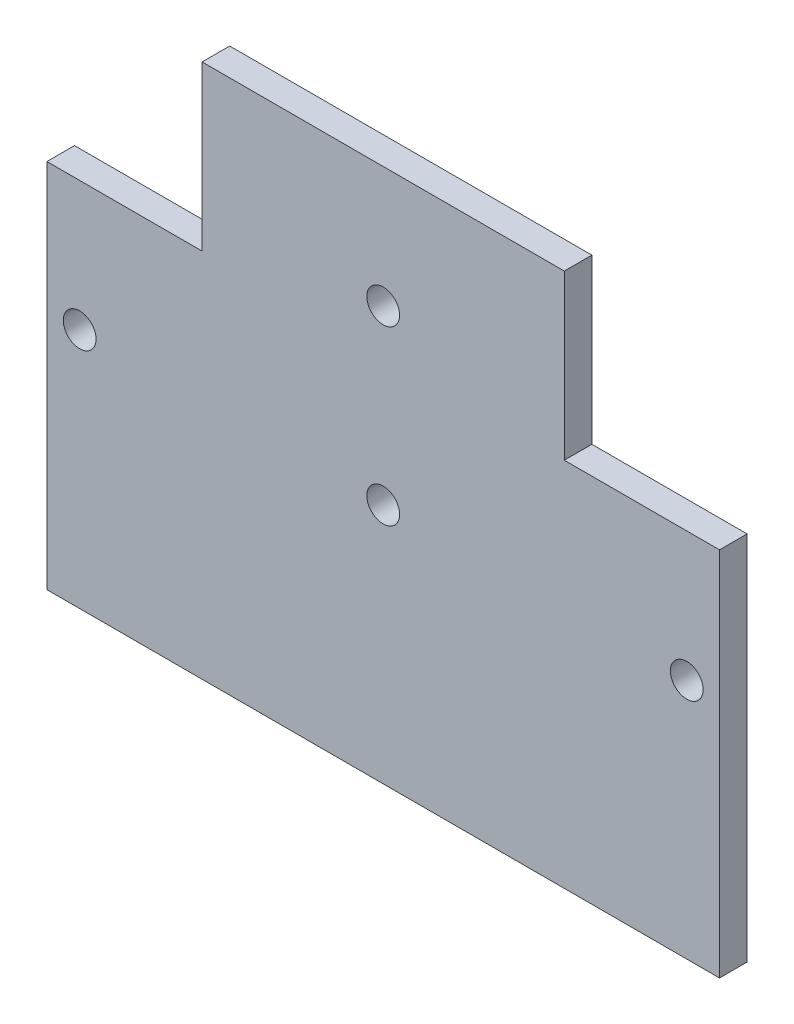
ISO-10303-21;
HEADER;
FILE_DESCRIPTION(('STEP AP214'),'2;1');
FILE_NAME('part.step','',(''),(''),'','','');
FILE_SCHEMA(('AUTOMOTIVE_DESIGN { 1 0 10303 214 1 1 1 1 }'));
ENDSEC;
DATA;
#1=APPLICATION_CONTEXT('core data for automotive mechanical design processes');
#2=APPLICATION_PROTOCOL_DEFINITION('international standard','automotive_design',2000,#1);
#3=PRODUCT_CONTEXT('',#1,'mechanical');
#4=PRODUCT('Part','Part','',(#3));
#5=PRODUCT_RELATED_PRODUCT_CATEGORY('part','',(#4));
#6=PRODUCT_DEFINITION_FORMATION('','',#4);
#7=PRODUCT_DEFINITION_CONTEXT('part definition',#1,'design');
#8=PRODUCT_DEFINITION('design','',#6,#7);
#9=PRODUCT_DEFINITION_SHAPE('','',#8);
#10=(LENGTH_UNIT() NAMED_UNIT(*) SI_UNIT(.MILLI.,.METRE.));
#11=(NAMED_UNIT(*) PLANE_ANGLE_UNIT() SI_UNIT($,.RADIAN.));
#12=(NAMED_UNIT(*) SI_UNIT($,.STERADIAN.) SOLID_ANGLE_UNIT());
#13=UNCERTAINTY_MEASURE_WITH_UNIT(LENGTH_MEASURE(1.E-05),#10,'distance_accuracy_value','');
#14=(GEOMETRIC_REPRESENTATION_CONTEXT(3) GLOBAL_UNCERTAINTY_ASSIGNED_CONTEXT((#13)) GLOBAL_UNIT_ASSIGNED_CONTEXT((#10,
#11,#12)) REPRESENTATION_CONTEXT('',''));
#15=CARTESIAN_POINT('',(0.,0.,0.));
#16=DIRECTION('',(0.,0.,1.));
#17=DIRECTION('',(1.,0.,0.));
#18=AXIS2_PLACEMENT_3D('',#15,#16,#17);
#19=CARTESIAN_POINT('',(0.,0.,1.6));
#20=DIRECTION('',(0.,0.,-1.));
#21=DIRECTION('',(-1.,0.,0.));
#22=AXIS2_PLACEMENT_3D('',#19,#20,#21);
#23=PLANE('',#22);
#24=DIRECTION('',(0.,-1.,0.));
#25=VECTOR('',#24,1.);
#26=CARTESIAN_POINT('',(-19.4999999999968,-15.5000000000015,1.6));
#27=LINE('',#26,#25);
#28=CARTESIAN_POINT('',(-19.4999999999968,6.00000000000011,1.6));
#29=VERTEX_POINT('',#28);
#30=CARTESIAN_POINT('',(-19.4999999999968,-15.5000000000015,1.6));
#31=VERTEX_POINT('',#30);
#32=EDGE_CURVE('E159',#29,#31,#27,.T.);
#33=ORIENTED_EDGE('',*,*,#32,.T.);
#34=DIRECTION('',(1.,0.,0.));
#35=VECTOR('',#34,1.);
#36=CARTESIAN_POINT('',(19.4999999999968,-15.5000000000015,1.6));
#37=LINE('',#36,#35);
#38=CARTESIAN_POINT('',(19.4999999999968,-15.5000000000015,1.6));
#39=VERTEX_POINT('',#38);
#40=EDGE_CURVE('E107',#31,#39,#37,.T.);
#41=ORIENTED_EDGE('',*,*,#40,.T.);
#42=DIRECTION('',(0.,1.,0.));
#43=VECTOR('',#42,1.);
#44=CARTESIAN_POINT('',(19.4999999999968,6.00000000000011,1.6));
#45=LINE('',#44,#43);
#46=CARTESIAN_POINT('',(19.4999999999968,6.00000000000011,1.6));
#47=VERTEX_POINT('',#46);
#48=EDGE_CURVE('E174',#39,#47,#45,.T.);
#49=ORIENTED_EDGE('',*,*,#48,.T.);
#50=DIRECTION('',(-1.,0.,0.));
#51=VECTOR('',#50,1.);
#52=CARTESIAN_POINT('',(10.5000000000037,6.00000000000011,1.6));
#53=LINE('',#52,#51);
#54=CARTESIAN_POINT('',(10.5000000000037,6.00000000000011,1.6));
#55=VERTEX_POINT('',#54);
#56=EDGE_CURVE('E187',#47,#55,#53,.T.);
#57=ORIENTED_EDGE('',*,*,#56,.T.);
#58=DIRECTION('',(0.,1.,0.));
#59=VECTOR('',#58,1.);
#60=CARTESIAN_POINT('',(10.5000000000037,15.5000000000015,1.6));
#61=LINE('',#60,#59);
#62=CARTESIAN_POINT('',(10.5000000000037,15.5000000000015,1.6));
#63=VERTEX_POINT('',#62);
#64=EDGE_CURVE('E126',#55,#63,#61,.T.);
#65=ORIENTED_EDGE('',*,*,#64,.T.);
#66=DIRECTION('',(-1.,0.,0.));
#67=VECTOR('',#66,1.);
#68=CARTESIAN_POINT('',(-10.5000007362177,15.5000000000015,1.6));
#69=LINE('',#68,#67);
#70=CARTESIAN_POINT('',(-10.5000007362177,15.5000000000015,1.6));
#71=VERTEX_POINT('',#70);
#72=EDGE_CURVE('E120',#63,#71,#69,.T.);
#73=ORIENTED_EDGE('',*,*,#72,.T.);
#74=DIRECTION('',(0.,-1.,0.));
#75=VECTOR('',#74,1.);
#76=CARTESIAN_POINT('',(-10.5000007362177,6.00000000000011,1.6));
#77=LINE('',#76,#75);
#78=CARTESIAN_POINT('',(-10.5000007362177,6.00000000000011,1.6));
#79=VERTEX_POINT('',#78);
#80=EDGE_CURVE('E124',#71,#79,#77,.T.);
#81=ORIENTED_EDGE('',*,*,#80,.T.);
#82=DIRECTION('',(-1.,0.,0.));
#83=VECTOR('',#82,1.);
#84=CARTESIAN_POINT('',(-19.4999999999968,6.00000000000011,1.6));
#85=LINE('',#84,#83);
#86=EDGE_CURVE('E64',#79,#29,#85,.T.);
#87=ORIENTED_EDGE('',*,*,#86,.T.);
#88=EDGE_LOOP('',(#33,#41,#49,#57,#65,#73,#81,#87));
#89=FACE_BOUND('',#88,.T.);
#90=CARTESIAN_POINT('',(-17.6,-1.49999999999637,1.6));
#91=DIRECTION('',(0.,0.,1.));
#92=DIRECTION('',(1.,0.,0.));
#93=AXIS2_PLACEMENT_3D('',#90,#91,#92);
#94=CIRCLE('',#93,0.950000000000008);
#95=CARTESIAN_POINT('',(-16.65,-1.49999999999637,1.6));
#96=VERTEX_POINT('',#95);
#97=EDGE_CURVE('E148',#96,#96,#94,.T.);
#98=ORIENTED_EDGE('',*,*,#97,.F.);
#99=EDGE_LOOP('',(#98));
#100=FACE_BOUND('',#99,.T.);
#101=CARTESIAN_POINT('',(0.,-1.49999999999637,1.6));
#102=DIRECTION('',(0.,0.,1.));
#103=DIRECTION('',(1.,0.,0.));
#104=AXIS2_PLACEMENT_3D('',#101,#102,#103);
#105=CIRCLE('',#104,0.950000000000004);
#106=CARTESIAN_POINT('',(0.950000000000004,-1.49999999999637,1.6));
#107=VERTEX_POINT('',#106);
#108=EDGE_CURVE('E196',#107,#107,#105,.T.);
#109=ORIENTED_EDGE('',*,*,#108,.F.);
#110=EDGE_LOOP('',(#109));
#111=FACE_BOUND('',#110,.T.);
#112=CARTESIAN_POINT('',(17.6,-1.49999999999637,1.6));
#113=DIRECTION('',(0.,0.,1.));
#114=DIRECTION('',(1.,0.,0.));
#115=AXIS2_PLACEMENT_3D('',#112,#113,#114);
#116=CIRCLE('',#115,0.950000000000008);
#117=CARTESIAN_POINT('',(18.55,-1.49999999999637,1.6));
#118=VERTEX_POINT('',#117);
#119=EDGE_CURVE('E202',#118,#118,#116,.T.);
#120=ORIENTED_EDGE('',*,*,#119,.F.);
#121=EDGE_LOOP('',(#120));
#122=FACE_BOUND('',#121,.T.);
#123=CARTESIAN_POINT('',(0.,8.50000000000342,1.6));
#124=DIRECTION('',(0.,0.,1.));
#125=DIRECTION('',(1.,0.,0.));
#126=AXIS2_PLACEMENT_3D('',#123,#124,#125);
#127=CIRCLE('',#126,0.950000000000004);
#128=CARTESIAN_POINT('',(0.950000000000004,8.50000000000342,1.6));
#129=VERTEX_POINT('',#128);
#130=EDGE_CURVE('E208',#129,#129,#127,.T.);
#131=ORIENTED_EDGE('',*,*,#130,.F.);
#132=EDGE_LOOP('',(#131));
#133=FACE_BOUND('',#132,.T.);
#134=ADVANCED_FACE('F47',(#89,#100,#111,#122,#133),#23,.F.);
#135=CARTESIAN_POINT('',(0.,0.,0.));
#136=DIRECTION('',(0.,0.,-1.));
#137=DIRECTION('',(-1.,0.,0.));
#138=AXIS2_PLACEMENT_3D('',#135,#136,#137);
#139=PLANE('',#138);
#140=CARTESIAN_POINT('',(17.6,-1.49999999999637,0.));
#141=DIRECTION('',(0.,0.,1.));
#142=DIRECTION('',(1.,0.,0.));
#143=AXIS2_PLACEMENT_3D('',#140,#141,#142);
#144=CIRCLE('',#143,0.950000000000008);
#145=CARTESIAN_POINT('',(18.55,-1.49999999999637,0.));
#146=VERTEX_POINT('',#145);
#147=EDGE_CURVE('E205',#146,#146,#144,.T.);
#148=ORIENTED_EDGE('',*,*,#147,.T.);
#149=EDGE_LOOP('',(#148));
#150=FACE_BOUND('',#149,.T.);
#151=CARTESIAN_POINT('',(-17.6,-1.49999999999637,0.));
#152=DIRECTION('',(0.,0.,1.));
#153=DIRECTION('',(1.,0.,0.));
#154=AXIS2_PLACEMENT_3D('',#151,#152,#153);
#155=CIRCLE('',#154,0.950000000000008);
#156=CARTESIAN_POINT('',(-16.65,-1.49999999999637,0.));
#157=VERTEX_POINT('',#156);
#158=EDGE_CURVE('E193',#157,#157,#155,.T.);
#159=ORIENTED_EDGE('',*,*,#158,.T.);
#160=EDGE_LOOP('',(#159));
#161=FACE_BOUND('',#160,.T.);
#162=DIRECTION('',(0.,-1.,0.));
#163=VECTOR('',#162,1.);
#164=CARTESIAN_POINT('',(-19.4999999999968,-15.5000000000015,0.));
#165=LINE('',#164,#163);
#166=CARTESIAN_POINT('',(-19.4999999999968,6.00000000000011,0.));
#167=VERTEX_POINT('',#166);
#168=CARTESIAN_POINT('',(-19.4999999999968,-15.5000000000015,0.));
#169=VERTEX_POINT('',#168);
#170=EDGE_CURVE('E144',#167,#169,#165,.T.);
#171=ORIENTED_EDGE('',*,*,#170,.F.);
#172=DIRECTION('',(-1.,0.,0.));
#173=VECTOR('',#172,1.);
#174=CARTESIAN_POINT('',(-19.4999999999968,6.00000000000011,0.));
#175=LINE('',#174,#173);
#176=CARTESIAN_POINT('',(-10.5000007362177,6.00000000000011,0.));
#177=VERTEX_POINT('',#176);
#178=EDGE_CURVE('E99',#177,#167,#175,.T.);
#179=ORIENTED_EDGE('',*,*,#178,.F.);
#180=DIRECTION('',(0.,-1.,0.));
#181=VECTOR('',#180,1.);
#182=CARTESIAN_POINT('',(-10.5000007362177,6.00000000000011,0.));
#183=LINE('',#182,#181);
#184=CARTESIAN_POINT('',(-10.5000007362177,15.5000000000015,0.));
#185=VERTEX_POINT('',#184);
#186=EDGE_CURVE('E93',#185,#177,#183,.T.);
#187=ORIENTED_EDGE('',*,*,#186,.F.);
#188=DIRECTION('',(-1.,0.,0.));
#189=VECTOR('',#188,1.);
#190=CARTESIAN_POINT('',(-10.5000007362177,15.5000000000015,0.));
#191=LINE('',#190,#189);
#192=CARTESIAN_POINT('',(10.5000000000037,15.5000000000015,0.));
#193=VERTEX_POINT('',#192);
#194=EDGE_CURVE('E134',#193,#185,#191,.T.);
#195=ORIENTED_EDGE('',*,*,#194,.F.);
#196=DIRECTION('',(0.,1.,0.));
#197=VECTOR('',#196,1.);
#198=CARTESIAN_POINT('',(10.5000000000037,15.5000000000015,0.));
#199=LINE('',#198,#197);
#200=CARTESIAN_POINT('',(10.5000000000037,6.00000000000011,0.));
#201=VERTEX_POINT('',#200);
#202=EDGE_CURVE('E154',#201,#193,#199,.T.);
#203=ORIENTED_EDGE('',*,*,#202,.F.);
#204=DIRECTION('',(-1.,0.,0.));
#205=VECTOR('',#204,1.);
#206=CARTESIAN_POINT('',(10.5000000000037,6.00000000000011,0.));
#207=LINE('',#206,#205);
#208=CARTESIAN_POINT('',(19.4999999999968,6.00000000000011,0.));
#209=VERTEX_POINT('',#208);
#210=EDGE_CURVE('E152',#209,#201,#207,.T.);
#211=ORIENTED_EDGE('',*,*,#210,.F.);
#212=DIRECTION('',(0.,1.,0.));
#213=VECTOR('',#212,1.);
#214=CARTESIAN_POINT('',(19.4999999999968,6.00000000000011,0.));
#215=LINE('',#214,#213);
#216=CARTESIAN_POINT('',(19.4999999999968,-15.5000000000015,0.));
#217=VERTEX_POINT('',#216);
#218=EDGE_CURVE('E150',#217,#209,#215,.T.);
#219=ORIENTED_EDGE('',*,*,#218,.F.);
#220=DIRECTION('',(1.,0.,0.));
#221=VECTOR('',#220,1.);
#222=CARTESIAN_POINT('',(19.4999999999968,-15.5000000000015,0.));
#223=LINE('',#222,#221);
#224=EDGE_CURVE('E147',#169,#217,#223,.T.);
#225=ORIENTED_EDGE('',*,*,#224,.F.);
#226=EDGE_LOOP('',(#171,#179,#187,#195,#203,#211,#219,#225));
#227=FACE_BOUND('',#226,.T.);
#228=CARTESIAN_POINT('',(0.,-1.49999999999637,0.));
#229=DIRECTION('',(0.,0.,1.));
#230=DIRECTION('',(1.,0.,0.));
#231=AXIS2_PLACEMENT_3D('',#228,#229,#230);
#232=CIRCLE('',#231,0.950000000000004);
#233=CARTESIAN_POINT('',(0.950000000000004,-1.49999999999637,0.));
#234=VERTEX_POINT('',#233);
#235=EDGE_CURVE('E199',#234,#234,#232,.T.);
#236=ORIENTED_EDGE('',*,*,#235,.T.);
#237=EDGE_LOOP('',(#236));
#238=FACE_BOUND('',#237,.T.);
#239=CARTESIAN_POINT('',(0.,8.50000000000342,0.));
#240=DIRECTION('',(0.,0.,1.));
#241=DIRECTION('',(1.,0.,0.));
#242=AXIS2_PLACEMENT_3D('',#239,#240,#241);
#243=CIRCLE('',#242,0.950000000000004);
#244=CARTESIAN_POINT('',(0.950000000000004,8.50000000000342,0.));
#245=VERTEX_POINT('',#244);
#246=EDGE_CURVE('E211',#245,#245,#243,.T.);
#247=ORIENTED_EDGE('',*,*,#246,.T.);
#248=EDGE_LOOP('',(#247));
#249=FACE_BOUND('',#248,.T.);
#250=ADVANCED_FACE('F178',(#150,#161,#227,#238,#249),#139,.T.);
#251=CARTESIAN_POINT('',(-19.4999999999968,-15.5000000000015,1.6));
#252=DIRECTION('',(1.,0.,0.));
#253=DIRECTION('',(0.,0.,-1.));
#254=AXIS2_PLACEMENT_3D('',#251,#252,#253);
#255=PLANE('',#254);
#256=ORIENTED_EDGE('',*,*,#170,.T.);
#257=DIRECTION('',(0.,0.,-1.));
#258=VECTOR('',#257,1.);
#259=CARTESIAN_POINT('',(-19.4999999999968,-15.5000000000015,1.6));
#260=LINE('',#259,#258);
#261=EDGE_CURVE('E11',#31,#169,#260,.T.);
#262=ORIENTED_EDGE('',*,*,#261,.F.);
#263=ORIENTED_EDGE('',*,*,#32,.F.);
#264=DIRECTION('',(0.,0.,-1.));
#265=VECTOR('',#264,1.);
#266=CARTESIAN_POINT('',(-19.4999999999968,6.00000000000011,1.6));
#267=LINE('',#266,#265);
#268=EDGE_CURVE('E140',#29,#167,#267,.T.);
#269=ORIENTED_EDGE('',*,*,#268,.T.);
#270=EDGE_LOOP('',(#256,#262,#263,#269));
#271=FACE_BOUND('',#270,.T.);
#272=ADVANCED_FACE('F49',(#271),#255,.F.);
#273=CARTESIAN_POINT('',(19.4999999999968,-15.5000000000015,1.6));
#274=DIRECTION('',(0.,1.,0.));
#275=DIRECTION('',(0.,0.,1.));
#276=AXIS2_PLACEMENT_3D('',#273,#274,#275);
#277=PLANE('',#276);
#278=ORIENTED_EDGE('',*,*,#224,.T.);
#279=DIRECTION('',(0.,0.,-1.));
#280=VECTOR('',#279,1.);
#281=CARTESIAN_POINT('',(19.4999999999968,-15.5000000000015,1.6));
#282=LINE('',#281,#280);
#283=EDGE_CURVE('E56',#39,#217,#282,.T.);
#284=ORIENTED_EDGE('',*,*,#283,.F.);
#285=ORIENTED_EDGE('',*,*,#40,.F.);
#286=ORIENTED_EDGE('',*,*,#261,.T.);
#287=EDGE_LOOP('',(#278,#284,#285,#286));
#288=FACE_BOUND('',#287,.T.);
#289=ADVANCED_FACE('F243',(#288),#277,.F.);
#290=CARTESIAN_POINT('',(19.4999999999968,6.00000000000011,1.6));
#291=DIRECTION('',(-1.,0.,0.));
#292=DIRECTION('',(0.,0.,1.));
#293=AXIS2_PLACEMENT_3D('',#290,#291,#292);
#294=PLANE('',#293);
#295=ORIENTED_EDGE('',*,*,#218,.T.);
#296=DIRECTION('',(0.,0.,-1.));
#297=VECTOR('',#296,1.);
#298=CARTESIAN_POINT('',(19.4999999999968,6.00000000000011,1.6));
#299=LINE('',#298,#297);
#300=EDGE_CURVE('E166',#47,#209,#299,.T.);
#301=ORIENTED_EDGE('',*,*,#300,.F.);
#302=ORIENTED_EDGE('',*,*,#48,.F.);
#303=ORIENTED_EDGE('',*,*,#283,.T.);
#304=EDGE_LOOP('',(#295,#301,#302,#303));
#305=FACE_BOUND('',#304,.T.);
#306=ADVANCED_FACE('F172',(#305),#294,.F.);
#307=CARTESIAN_POINT('',(10.5000000000037,6.00000000000011,1.6));
#308=DIRECTION('',(0.,-1.,0.));
#309=DIRECTION('',(0.,0.,-1.));
#310=AXIS2_PLACEMENT_3D('',#307,#308,#309);
#311=PLANE('',#310);
#312=ORIENTED_EDGE('',*,*,#210,.T.);
#313=DIRECTION('',(0.,0.,-1.));
#314=VECTOR('',#313,1.);
#315=CARTESIAN_POINT('',(10.5000000000037,6.00000000000011,1.6));
#316=LINE('',#315,#314);
#317=EDGE_CURVE('E163',#55,#201,#316,.T.);
#318=ORIENTED_EDGE('',*,*,#317,.F.);
#319=ORIENTED_EDGE('',*,*,#56,.F.);
#320=ORIENTED_EDGE('',*,*,#300,.T.);
#321=EDGE_LOOP('',(#312,#318,#319,#320));
#322=FACE_BOUND('',#321,.T.);
#323=ADVANCED_FACE('F183',(#322),#311,.F.);
#324=CARTESIAN_POINT('',(10.5000000000037,15.5000000000015,1.6));
#325=DIRECTION('',(-1.,0.,0.));
#326=DIRECTION('',(0.,0.,1.));
#327=AXIS2_PLACEMENT_3D('',#324,#325,#326);
#328=PLANE('',#327);
#329=ORIENTED_EDGE('',*,*,#202,.T.);
#330=DIRECTION('',(0.,0.,-1.));
#331=VECTOR('',#330,1.);
#332=CARTESIAN_POINT('',(10.5000000000037,15.5000000000015,1.6));
#333=LINE('',#332,#331);
#334=EDGE_CURVE('E135',#63,#193,#333,.T.);
#335=ORIENTED_EDGE('',*,*,#334,.F.);
#336=ORIENTED_EDGE('',*,*,#64,.F.);
#337=ORIENTED_EDGE('',*,*,#317,.T.);
#338=EDGE_LOOP('',(#329,#335,#336,#337));
#339=FACE_BOUND('',#338,.T.);
#340=ADVANCED_FACE('F186',(#339),#328,.F.);
#341=CARTESIAN_POINT('',(-10.5000007362177,15.5000000000015,1.6));
#342=DIRECTION('',(0.,-1.,0.));
#343=DIRECTION('',(0.,0.,-1.));
#344=AXIS2_PLACEMENT_3D('',#341,#342,#343);
#345=PLANE('',#344);
#346=ORIENTED_EDGE('',*,*,#194,.T.);
#347=DIRECTION('',(0.,0.,-1.));
#348=VECTOR('',#347,1.);
#349=CARTESIAN_POINT('',(-10.5000007362177,15.5000000000015,1.6));
#350=LINE('',#349,#348);
#351=EDGE_CURVE('E131',#71,#185,#350,.T.);
#352=ORIENTED_EDGE('',*,*,#351,.F.);
#353=ORIENTED_EDGE('',*,*,#72,.F.);
#354=ORIENTED_EDGE('',*,*,#334,.T.);
#355=EDGE_LOOP('',(#346,#352,#353,#354));
#356=FACE_BOUND('',#355,.T.);
#357=ADVANCED_FACE('F132',(#356),#345,.F.);
#358=CARTESIAN_POINT('',(-10.5000007362177,6.00000000000011,1.6));
#359=DIRECTION('',(1.,0.,0.));
#360=DIRECTION('',(0.,1.,0.));
#361=AXIS2_PLACEMENT_3D('',#358,#359,#360);
#362=PLANE('',#361);
#363=ORIENTED_EDGE('',*,*,#186,.T.);
#364=DIRECTION('',(0.,0.,-1.));
#365=VECTOR('',#364,1.);
#366=CARTESIAN_POINT('',(-10.5000007362177,6.00000000000011,1.6));
#367=LINE('',#366,#365);
#368=EDGE_CURVE('E136',#79,#177,#367,.T.);
#369=ORIENTED_EDGE('',*,*,#368,.F.);
#370=ORIENTED_EDGE('',*,*,#80,.F.);
#371=ORIENTED_EDGE('',*,*,#351,.T.);
#372=EDGE_LOOP('',(#363,#369,#370,#371));
#373=FACE_BOUND('',#372,.T.);
#374=ADVANCED_FACE('F138',(#373),#362,.F.);
#375=CARTESIAN_POINT('',(-19.4999999999968,6.00000000000011,1.6));
#376=DIRECTION('',(0.,-1.,0.));
#377=DIRECTION('',(0.,0.,-1.));
#378=AXIS2_PLACEMENT_3D('',#375,#376,#377);
#379=PLANE('',#378);
#380=ORIENTED_EDGE('',*,*,#178,.T.);
#381=ORIENTED_EDGE('',*,*,#268,.F.);
#382=ORIENTED_EDGE('',*,*,#86,.F.);
#383=ORIENTED_EDGE('',*,*,#368,.T.);
#384=EDGE_LOOP('',(#380,#381,#382,#383));
#385=FACE_BOUND('',#384,.T.);
#386=ADVANCED_FACE('F231',(#385),#379,.F.);
#387=CARTESIAN_POINT('',(-17.6,-1.49999999999637,1.6));
#388=DIRECTION('',(0.,0.,-1.));
#389=DIRECTION('',(-1.,0.,0.));
#390=AXIS2_PLACEMENT_3D('',#387,#388,#389);
#391=CYLINDRICAL_SURFACE('',#390,0.950000000000008);
#392=ORIENTED_EDGE('',*,*,#97,.T.);
#393=EDGE_LOOP('',(#392));
#394=FACE_BOUND('',#393,.T.);
#395=ORIENTED_EDGE('',*,*,#158,.F.);
#396=EDGE_LOOP('',(#395));
#397=FACE_BOUND('',#396,.T.);
#398=ADVANCED_FACE('F228',(#394,#397),#391,.F.);
#399=CARTESIAN_POINT('',(0.,-1.49999999999637,1.6));
#400=DIRECTION('',(0.,0.,-1.));
#401=DIRECTION('',(-1.,0.,0.));
#402=AXIS2_PLACEMENT_3D('',#399,#400,#401);
#403=CYLINDRICAL_SURFACE('',#402,0.950000000000004);
#404=ORIENTED_EDGE('',*,*,#108,.T.);
#405=EDGE_LOOP('',(#404));
#406=FACE_BOUND('',#405,.T.);
#407=ORIENTED_EDGE('',*,*,#235,.F.);
#408=EDGE_LOOP('',(#407));
#409=FACE_BOUND('',#408,.T.);
#410=ADVANCED_FACE('F301',(#406,#409),#403,.F.);
#411=CARTESIAN_POINT('',(17.6,-1.49999999999637,1.6));
#412=DIRECTION('',(0.,0.,-1.));
#413=DIRECTION('',(-1.,0.,0.));
#414=AXIS2_PLACEMENT_3D('',#411,#412,#413);
#415=CYLINDRICAL_SURFACE('',#414,0.950000000000008);
#416=ORIENTED_EDGE('',*,*,#119,.T.);
#417=EDGE_LOOP('',(#416));
#418=FACE_BOUND('',#417,.T.);
#419=ORIENTED_EDGE('',*,*,#147,.F.);
#420=EDGE_LOOP('',(#419));
#421=FACE_BOUND('',#420,.T.);
#422=ADVANCED_FACE('F308',(#418,#421),#415,.F.);
#423=CARTESIAN_POINT('',(0.,8.50000000000342,1.6));
#424=DIRECTION('',(0.,0.,-1.));
#425=DIRECTION('',(-1.,0.,0.));
#426=AXIS2_PLACEMENT_3D('',#423,#424,#425);
#427=CYLINDRICAL_SURFACE('',#426,0.950000000000004);
#428=ORIENTED_EDGE('',*,*,#130,.T.);
#429=EDGE_LOOP('',(#428));
#430=FACE_BOUND('',#429,.T.);
#431=ORIENTED_EDGE('',*,*,#246,.F.);
#432=EDGE_LOOP('',(#431));
#433=FACE_BOUND('',#432,.T.);
#434=ADVANCED_FACE('F217',(#430,#433),#427,.F.);
#435=CLOSED_SHELL('',(#134,#250,#272,#289,#306,#323,#340,#357,#374,#386,#398,#410,#422,#434));
#436=MANIFOLD_SOLID_BREP('B2',#435);
#437=ADVANCED_BREP_SHAPE_REPRESENTATION('',(#18,#436),#14);
#438=SHAPE_DEFINITION_REPRESENTATION(#9,#437);
ENDSEC;
END-ISO-10303-21;
